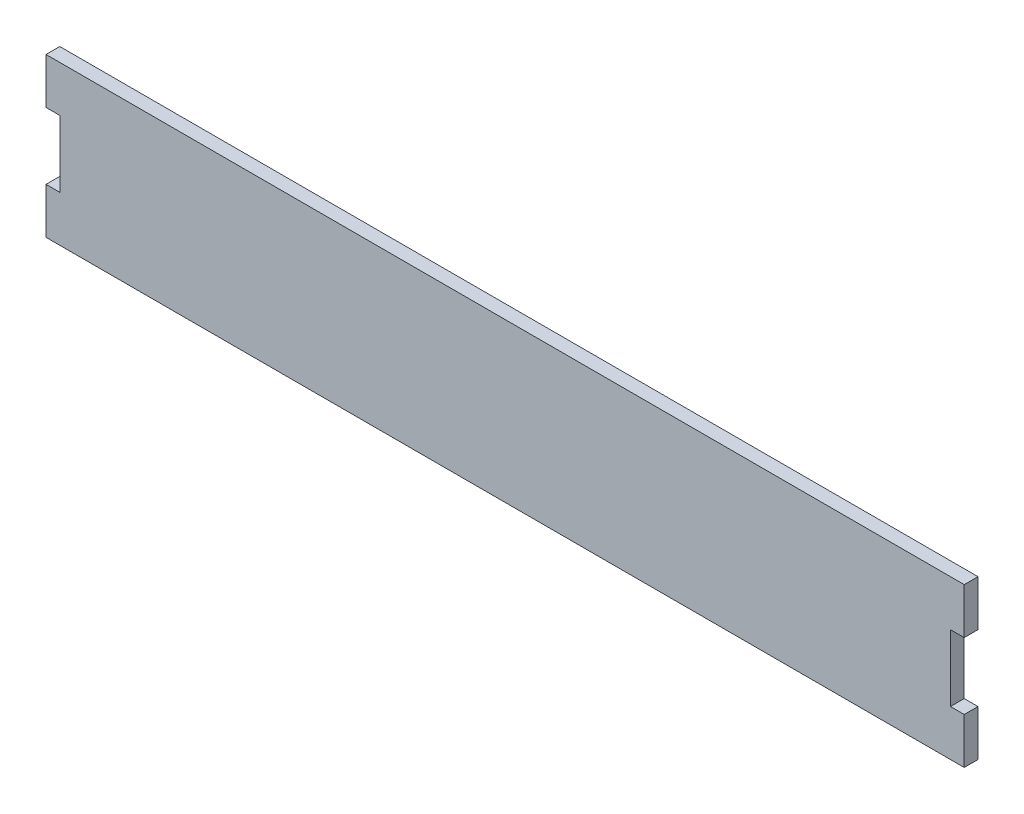
ISO-10303-21;
HEADER;
FILE_DESCRIPTION(('STEP AP214'),'2;1');
FILE_NAME('part.step','',(''),(''),'','','');
FILE_SCHEMA(('AUTOMOTIVE_DESIGN { 1 0 10303 214 1 1 1 1 }'));
ENDSEC;
DATA;
#1=APPLICATION_CONTEXT('core data for automotive mechanical design processes');
#2=APPLICATION_PROTOCOL_DEFINITION('international standard','automotive_design',2000,#1);
#3=PRODUCT_CONTEXT('',#1,'mechanical');
#4=PRODUCT('Part','Part','',(#3));
#5=PRODUCT_RELATED_PRODUCT_CATEGORY('part','',(#4));
#6=PRODUCT_DEFINITION_FORMATION('','',#4);
#7=PRODUCT_DEFINITION_CONTEXT('part definition',#1,'design');
#8=PRODUCT_DEFINITION('design','',#6,#7);
#9=PRODUCT_DEFINITION_SHAPE('','',#8);
#10=(LENGTH_UNIT() NAMED_UNIT(*) SI_UNIT(.MILLI.,.METRE.));
#11=(NAMED_UNIT(*) PLANE_ANGLE_UNIT() SI_UNIT($,.RADIAN.));
#12=(NAMED_UNIT(*) SI_UNIT($,.STERADIAN.) SOLID_ANGLE_UNIT());
#13=UNCERTAINTY_MEASURE_WITH_UNIT(LENGTH_MEASURE(1.E-05),#10,'distance_accuracy_value','');
#14=(GEOMETRIC_REPRESENTATION_CONTEXT(3) GLOBAL_UNCERTAINTY_ASSIGNED_CONTEXT((#13)) GLOBAL_UNIT_ASSIGNED_CONTEXT((#10,
#11,#12)) REPRESENTATION_CONTEXT('',''));
#15=CARTESIAN_POINT('',(0.,0.,0.));
#16=DIRECTION('',(0.,0.,1.));
#17=DIRECTION('',(1.,0.,0.));
#18=AXIS2_PLACEMENT_3D('',#15,#16,#17);
#19=CARTESIAN_POINT('',(0.,0.,3.));
#20=DIRECTION('',(0.,1.,0.));
#21=DIRECTION('',(0.,0.,1.));
#22=AXIS2_PLACEMENT_3D('',#19,#20,#21);
#23=PLANE('',#22);
#24=DIRECTION('',(1.,0.,0.));
#25=VECTOR('',#24,1.);
#26=CARTESIAN_POINT('',(0.,0.,0.));
#27=LINE('',#26,#25);
#28=CARTESIAN_POINT('',(0.,0.,0.));
#29=VERTEX_POINT('',#28);
#30=CARTESIAN_POINT('',(200.,0.,0.));
#31=VERTEX_POINT('',#30);
#32=EDGE_CURVE('E153',#29,#31,#27,.T.);
#33=ORIENTED_EDGE('',*,*,#32,.T.);
#34=DIRECTION('',(0.,0.,-1.));
#35=VECTOR('',#34,1.);
#36=CARTESIAN_POINT('',(200.,0.,3.));
#37=LINE('',#36,#35);
#38=CARTESIAN_POINT('',(200.,0.,3.));
#39=VERTEX_POINT('',#38);
#40=EDGE_CURVE('E11',#39,#31,#37,.T.);
#41=ORIENTED_EDGE('',*,*,#40,.F.);
#42=DIRECTION('',(1.,0.,0.));
#43=VECTOR('',#42,1.);
#44=CARTESIAN_POINT('',(0.,0.,3.));
#45=LINE('',#44,#43);
#46=CARTESIAN_POINT('',(0.,0.,3.));
#47=VERTEX_POINT('',#46);
#48=EDGE_CURVE('E175',#47,#39,#45,.T.);
#49=ORIENTED_EDGE('',*,*,#48,.F.);
#50=DIRECTION('',(0.,0.,-1.));
#51=VECTOR('',#50,1.);
#52=CARTESIAN_POINT('',(0.,0.,3.));
#53=LINE('',#52,#51);
#54=EDGE_CURVE('E149',#47,#29,#53,.T.);
#55=ORIENTED_EDGE('',*,*,#54,.T.);
#56=EDGE_LOOP('',(#33,#41,#49,#55));
#57=FACE_BOUND('',#56,.T.);
#58=ADVANCED_FACE('F33',(#57),#23,.F.);
#59=CARTESIAN_POINT('',(200.,10.,3.));
#60=DIRECTION('',(-1.,0.,0.));
#61=DIRECTION('',(0.,-1.,0.));
#62=AXIS2_PLACEMENT_3D('',#59,#60,#61);
#63=PLANE('',#62);
#64=DIRECTION('',(0.,1.,0.));
#65=VECTOR('',#64,1.);
#66=CARTESIAN_POINT('',(200.,10.,0.));
#67=LINE('',#66,#65);
#68=CARTESIAN_POINT('',(200.,10.,0.));
#69=VERTEX_POINT('',#68);
#70=EDGE_CURVE('E156',#31,#69,#67,.T.);
#71=ORIENTED_EDGE('',*,*,#70,.T.);
#72=DIRECTION('',(0.,0.,-1.));
#73=VECTOR('',#72,1.);
#74=CARTESIAN_POINT('',(200.,10.,3.));
#75=LINE('',#74,#73);
#76=CARTESIAN_POINT('',(200.,10.,3.));
#77=VERTEX_POINT('',#76);
#78=EDGE_CURVE('E41',#77,#69,#75,.T.);
#79=ORIENTED_EDGE('',*,*,#78,.F.);
#80=DIRECTION('',(0.,1.,0.));
#81=VECTOR('',#80,1.);
#82=CARTESIAN_POINT('',(200.,10.,3.));
#83=LINE('',#82,#81);
#84=EDGE_CURVE('E104',#39,#77,#83,.T.);
#85=ORIENTED_EDGE('',*,*,#84,.F.);
#86=ORIENTED_EDGE('',*,*,#40,.T.);
#87=EDGE_LOOP('',(#71,#79,#85,#86));
#88=FACE_BOUND('',#87,.T.);
#89=ADVANCED_FACE('F253',(#88),#63,.F.);
#90=CARTESIAN_POINT('',(197.,10.,3.));
#91=DIRECTION('',(0.,-1.,0.));
#92=DIRECTION('',(0.,0.,-1.));
#93=AXIS2_PLACEMENT_3D('',#90,#91,#92);
#94=PLANE('',#93);
#95=DIRECTION('',(-1.,0.,0.));
#96=VECTOR('',#95,1.);
#97=CARTESIAN_POINT('',(197.,10.,0.));
#98=LINE('',#97,#96);
#99=CARTESIAN_POINT('',(197.,10.,0.));
#100=VERTEX_POINT('',#99);
#101=EDGE_CURVE('E158',#69,#100,#98,.T.);
#102=ORIENTED_EDGE('',*,*,#101,.T.);
#103=DIRECTION('',(0.,0.,-1.));
#104=VECTOR('',#103,1.);
#105=CARTESIAN_POINT('',(197.,10.,3.));
#106=LINE('',#105,#104);
#107=CARTESIAN_POINT('',(197.,10.,3.));
#108=VERTEX_POINT('',#107);
#109=EDGE_CURVE('E194',#108,#100,#106,.T.);
#110=ORIENTED_EDGE('',*,*,#109,.F.);
#111=DIRECTION('',(-1.,0.,0.));
#112=VECTOR('',#111,1.);
#113=CARTESIAN_POINT('',(197.,10.,3.));
#114=LINE('',#113,#112);
#115=EDGE_CURVE('E202',#77,#108,#114,.T.);
#116=ORIENTED_EDGE('',*,*,#115,.F.);
#117=ORIENTED_EDGE('',*,*,#78,.T.);
#118=EDGE_LOOP('',(#102,#110,#116,#117));
#119=FACE_BOUND('',#118,.T.);
#120=ADVANCED_FACE('F200',(#119),#94,.F.);
#121=CARTESIAN_POINT('',(197.,24.5,3.));
#122=DIRECTION('',(-1.,0.,0.));
#123=DIRECTION('',(0.,0.,1.));
#124=AXIS2_PLACEMENT_3D('',#121,#122,#123);
#125=PLANE('',#124);
#126=DIRECTION('',(0.,1.,0.));
#127=VECTOR('',#126,1.);
#128=CARTESIAN_POINT('',(197.,24.5,0.));
#129=LINE('',#128,#127);
#130=CARTESIAN_POINT('',(197.,24.5,0.));
#131=VERTEX_POINT('',#130);
#132=EDGE_CURVE('E160',#100,#131,#129,.T.);
#133=ORIENTED_EDGE('',*,*,#132,.T.);
#134=DIRECTION('',(0.,0.,-1.));
#135=VECTOR('',#134,1.);
#136=CARTESIAN_POINT('',(197.,24.5,3.));
#137=LINE('',#136,#135);
#138=CARTESIAN_POINT('',(197.,24.5,3.));
#139=VERTEX_POINT('',#138);
#140=EDGE_CURVE('E191',#139,#131,#137,.T.);
#141=ORIENTED_EDGE('',*,*,#140,.F.);
#142=DIRECTION('',(0.,1.,0.));
#143=VECTOR('',#142,1.);
#144=CARTESIAN_POINT('',(197.,24.5,3.));
#145=LINE('',#144,#143);
#146=EDGE_CURVE('E220',#108,#139,#145,.T.);
#147=ORIENTED_EDGE('',*,*,#146,.F.);
#148=ORIENTED_EDGE('',*,*,#109,.T.);
#149=EDGE_LOOP('',(#133,#141,#147,#148));
#150=FACE_BOUND('',#149,.T.);
#151=ADVANCED_FACE('F211',(#150),#125,.F.);
#152=CARTESIAN_POINT('',(200.,24.5,3.));
#153=DIRECTION('',(0.,1.,0.));
#154=DIRECTION('',(0.,0.,1.));
#155=AXIS2_PLACEMENT_3D('',#152,#153,#154);
#156=PLANE('',#155);
#157=DIRECTION('',(1.,0.,0.));
#158=VECTOR('',#157,1.);
#159=CARTESIAN_POINT('',(200.,24.5,0.));
#160=LINE('',#159,#158);
#161=CARTESIAN_POINT('',(200.,24.5,0.));
#162=VERTEX_POINT('',#161);
#163=EDGE_CURVE('E162',#131,#162,#160,.T.);
#164=ORIENTED_EDGE('',*,*,#163,.T.);
#165=DIRECTION('',(0.,0.,-1.));
#166=VECTOR('',#165,1.);
#167=CARTESIAN_POINT('',(200.,24.5,3.));
#168=LINE('',#167,#166);
#169=CARTESIAN_POINT('',(200.,24.5,3.));
#170=VERTEX_POINT('',#169);
#171=EDGE_CURVE('E188',#170,#162,#168,.T.);
#172=ORIENTED_EDGE('',*,*,#171,.F.);
#173=DIRECTION('',(1.,0.,0.));
#174=VECTOR('',#173,1.);
#175=CARTESIAN_POINT('',(200.,24.5,3.));
#176=LINE('',#175,#174);
#177=EDGE_CURVE('E217',#139,#170,#176,.T.);
#178=ORIENTED_EDGE('',*,*,#177,.F.);
#179=ORIENTED_EDGE('',*,*,#140,.T.);
#180=EDGE_LOOP('',(#164,#172,#178,#179));
#181=FACE_BOUND('',#180,.T.);
#182=ADVANCED_FACE('F215',(#181),#156,.F.);
#183=CARTESIAN_POINT('',(200.,34.5,3.));
#184=DIRECTION('',(-1.,0.,0.));
#185=DIRECTION('',(0.,-1.,0.));
#186=AXIS2_PLACEMENT_3D('',#183,#184,#185);
#187=PLANE('',#186);
#188=DIRECTION('',(0.,1.,0.));
#189=VECTOR('',#188,1.);
#190=CARTESIAN_POINT('',(200.,34.5,0.));
#191=LINE('',#190,#189);
#192=CARTESIAN_POINT('',(200.,34.5,0.));
#193=VERTEX_POINT('',#192);
#194=EDGE_CURVE('E164',#162,#193,#191,.T.);
#195=ORIENTED_EDGE('',*,*,#194,.T.);
#196=DIRECTION('',(0.,0.,-1.));
#197=VECTOR('',#196,1.);
#198=CARTESIAN_POINT('',(200.,34.5,3.));
#199=LINE('',#198,#197);
#200=CARTESIAN_POINT('',(200.,34.5,3.));
#201=VERTEX_POINT('',#200);
#202=EDGE_CURVE('E185',#201,#193,#199,.T.);
#203=ORIENTED_EDGE('',*,*,#202,.F.);
#204=DIRECTION('',(0.,1.,0.));
#205=VECTOR('',#204,1.);
#206=CARTESIAN_POINT('',(200.,34.5,3.));
#207=LINE('',#206,#205);
#208=EDGE_CURVE('E219',#170,#201,#207,.T.);
#209=ORIENTED_EDGE('',*,*,#208,.F.);
#210=ORIENTED_EDGE('',*,*,#171,.T.);
#211=EDGE_LOOP('',(#195,#203,#209,#210));
#212=FACE_BOUND('',#211,.T.);
#213=ADVANCED_FACE('F266',(#212),#187,.F.);
#214=CARTESIAN_POINT('',(0.,34.5,3.));
#215=DIRECTION('',(0.,-1.,0.));
#216=DIRECTION('',(0.,0.,-1.));
#217=AXIS2_PLACEMENT_3D('',#214,#215,#216);
#218=PLANE('',#217);
#219=DIRECTION('',(-1.,0.,0.));
#220=VECTOR('',#219,1.);
#221=CARTESIAN_POINT('',(0.,34.5,0.));
#222=LINE('',#221,#220);
#223=CARTESIAN_POINT('',(0.,34.5,0.));
#224=VERTEX_POINT('',#223);
#225=EDGE_CURVE('E166',#193,#224,#222,.T.);
#226=ORIENTED_EDGE('',*,*,#225,.T.);
#227=DIRECTION('',(0.,0.,-1.));
#228=VECTOR('',#227,1.);
#229=CARTESIAN_POINT('',(0.,34.5,3.));
#230=LINE('',#229,#228);
#231=CARTESIAN_POINT('',(0.,34.5,3.));
#232=VERTEX_POINT('',#231);
#233=EDGE_CURVE('E182',#232,#224,#230,.T.);
#234=ORIENTED_EDGE('',*,*,#233,.F.);
#235=DIRECTION('',(-1.,0.,0.));
#236=VECTOR('',#235,1.);
#237=CARTESIAN_POINT('',(0.,34.5,3.));
#238=LINE('',#237,#236);
#239=EDGE_CURVE('E222',#201,#232,#238,.T.);
#240=ORIENTED_EDGE('',*,*,#239,.F.);
#241=ORIENTED_EDGE('',*,*,#202,.T.);
#242=EDGE_LOOP('',(#226,#234,#240,#241));
#243=FACE_BOUND('',#242,.T.);
#244=ADVANCED_FACE('F269',(#243),#218,.F.);
#245=CARTESIAN_POINT('',(0.,34.5,3.));
#246=DIRECTION('',(1.,0.,0.));
#247=DIRECTION('',(0.,0.,-1.));
#248=AXIS2_PLACEMENT_3D('',#245,#246,#247);
#249=PLANE('',#248);
#250=DIRECTION('',(0.,-1.,0.));
#251=VECTOR('',#250,1.);
#252=CARTESIAN_POINT('',(0.,34.5,0.));
#253=LINE('',#252,#251);
#254=CARTESIAN_POINT('',(0.,24.5,0.));
#255=VERTEX_POINT('',#254);
#256=EDGE_CURVE('E168',#224,#255,#253,.T.);
#257=ORIENTED_EDGE('',*,*,#256,.T.);
#258=DIRECTION('',(0.,0.,-1.));
#259=VECTOR('',#258,1.);
#260=CARTESIAN_POINT('',(0.,24.5,3.));
#261=LINE('',#260,#259);
#262=CARTESIAN_POINT('',(0.,24.5,3.));
#263=VERTEX_POINT('',#262);
#264=EDGE_CURVE('E179',#263,#255,#261,.T.);
#265=ORIENTED_EDGE('',*,*,#264,.F.);
#266=DIRECTION('',(0.,-1.,0.));
#267=VECTOR('',#266,1.);
#268=CARTESIAN_POINT('',(0.,34.5,3.));
#269=LINE('',#268,#267);
#270=EDGE_CURVE('E228',#232,#263,#269,.T.);
#271=ORIENTED_EDGE('',*,*,#270,.F.);
#272=ORIENTED_EDGE('',*,*,#233,.T.);
#273=EDGE_LOOP('',(#257,#265,#271,#272));
#274=FACE_BOUND('',#273,.T.);
#275=ADVANCED_FACE('F234',(#274),#249,.F.);
#276=CARTESIAN_POINT('',(0.,24.5,3.));
#277=DIRECTION('',(0.,1.,0.));
#278=DIRECTION('',(0.,0.,1.));
#279=AXIS2_PLACEMENT_3D('',#276,#277,#278);
#280=PLANE('',#279);
#281=DIRECTION('',(1.,0.,0.));
#282=VECTOR('',#281,1.);
#283=CARTESIAN_POINT('',(0.,24.5,0.));
#284=LINE('',#283,#282);
#285=CARTESIAN_POINT('',(3.,24.5,0.));
#286=VERTEX_POINT('',#285);
#287=EDGE_CURVE('E170',#255,#286,#284,.T.);
#288=ORIENTED_EDGE('',*,*,#287,.T.);
#289=DIRECTION('',(0.,0.,-1.));
#290=VECTOR('',#289,1.);
#291=CARTESIAN_POINT('',(3.,24.5,3.));
#292=LINE('',#291,#290);
#293=CARTESIAN_POINT('',(3.,24.5,3.));
#294=VERTEX_POINT('',#293);
#295=EDGE_CURVE('E144',#294,#286,#292,.T.);
#296=ORIENTED_EDGE('',*,*,#295,.F.);
#297=DIRECTION('',(1.,0.,0.));
#298=VECTOR('',#297,1.);
#299=CARTESIAN_POINT('',(0.,24.5,3.));
#300=LINE('',#299,#298);
#301=EDGE_CURVE('E135',#263,#294,#300,.T.);
#302=ORIENTED_EDGE('',*,*,#301,.F.);
#303=ORIENTED_EDGE('',*,*,#264,.T.);
#304=EDGE_LOOP('',(#288,#296,#302,#303));
#305=FACE_BOUND('',#304,.T.);
#306=ADVANCED_FACE('F238',(#305),#280,.F.);
#307=CARTESIAN_POINT('',(3.,24.5,3.));
#308=DIRECTION('',(1.,0.,0.));
#309=DIRECTION('',(0.,0.,-1.));
#310=AXIS2_PLACEMENT_3D('',#307,#308,#309);
#311=PLANE('',#310);
#312=DIRECTION('',(0.,-1.,0.));
#313=VECTOR('',#312,1.);
#314=CARTESIAN_POINT('',(3.,24.5,0.));
#315=LINE('',#314,#313);
#316=CARTESIAN_POINT('',(3.,10.,0.));
#317=VERTEX_POINT('',#316);
#318=EDGE_CURVE('E143',#286,#317,#315,.T.);
#319=ORIENTED_EDGE('',*,*,#318,.T.);
#320=DIRECTION('',(0.,0.,-1.));
#321=VECTOR('',#320,1.);
#322=CARTESIAN_POINT('',(3.,10.,3.));
#323=LINE('',#322,#321);
#324=CARTESIAN_POINT('',(3.,10.,3.));
#325=VERTEX_POINT('',#324);
#326=EDGE_CURVE('E140',#325,#317,#323,.T.);
#327=ORIENTED_EDGE('',*,*,#326,.F.);
#328=DIRECTION('',(0.,-1.,0.));
#329=VECTOR('',#328,1.);
#330=CARTESIAN_POINT('',(3.,24.5,3.));
#331=LINE('',#330,#329);
#332=EDGE_CURVE('E129',#294,#325,#331,.T.);
#333=ORIENTED_EDGE('',*,*,#332,.F.);
#334=ORIENTED_EDGE('',*,*,#295,.T.);
#335=EDGE_LOOP('',(#319,#327,#333,#334));
#336=FACE_BOUND('',#335,.T.);
#337=ADVANCED_FACE('F141',(#336),#311,.F.);
#338=CARTESIAN_POINT('',(0.,10.,3.));
#339=DIRECTION('',(0.,-1.,0.));
#340=DIRECTION('',(0.,0.,-1.));
#341=AXIS2_PLACEMENT_3D('',#338,#339,#340);
#342=PLANE('',#341);
#343=DIRECTION('',(-1.,0.,0.));
#344=VECTOR('',#343,1.);
#345=CARTESIAN_POINT('',(0.,10.,0.));
#346=LINE('',#345,#344);
#347=CARTESIAN_POINT('',(0.,10.,0.));
#348=VERTEX_POINT('',#347);
#349=EDGE_CURVE('E90',#317,#348,#346,.T.);
#350=ORIENTED_EDGE('',*,*,#349,.T.);
#351=DIRECTION('',(0.,0.,-1.));
#352=VECTOR('',#351,1.);
#353=CARTESIAN_POINT('',(0.,10.,3.));
#354=LINE('',#353,#352);
#355=CARTESIAN_POINT('',(0.,10.,3.));
#356=VERTEX_POINT('',#355);
#357=EDGE_CURVE('E145',#356,#348,#354,.T.);
#358=ORIENTED_EDGE('',*,*,#357,.F.);
#359=DIRECTION('',(-1.,0.,0.));
#360=VECTOR('',#359,1.);
#361=CARTESIAN_POINT('',(0.,10.,3.));
#362=LINE('',#361,#360);
#363=EDGE_CURVE('E133',#325,#356,#362,.T.);
#364=ORIENTED_EDGE('',*,*,#363,.F.);
#365=ORIENTED_EDGE('',*,*,#326,.T.);
#366=EDGE_LOOP('',(#350,#358,#364,#365));
#367=FACE_BOUND('',#366,.T.);
#368=ADVANCED_FACE('F147',(#367),#342,.F.);
#369=CARTESIAN_POINT('',(0.,0.,3.));
#370=DIRECTION('',(1.,0.,0.));
#371=DIRECTION('',(0.,0.,-1.));
#372=AXIS2_PLACEMENT_3D('',#369,#370,#371);
#373=PLANE('',#372);
#374=DIRECTION('',(0.,-1.,0.));
#375=VECTOR('',#374,1.);
#376=CARTESIAN_POINT('',(0.,0.,0.));
#377=LINE('',#376,#375);
#378=EDGE_CURVE('E96',#348,#29,#377,.T.);
#379=ORIENTED_EDGE('',*,*,#378,.T.);
#380=ORIENTED_EDGE('',*,*,#54,.F.);
#381=DIRECTION('',(0.,-1.,0.));
#382=VECTOR('',#381,1.);
#383=CARTESIAN_POINT('',(0.,0.,3.));
#384=LINE('',#383,#382);
#385=EDGE_CURVE('E49',#356,#47,#384,.T.);
#386=ORIENTED_EDGE('',*,*,#385,.F.);
#387=ORIENTED_EDGE('',*,*,#357,.T.);
#388=EDGE_LOOP('',(#379,#380,#386,#387));
#389=FACE_BOUND('',#388,.T.);
#390=ADVANCED_FACE('F242',(#389),#373,.F.);
#391=CARTESIAN_POINT('',(0.,0.,3.));
#392=DIRECTION('',(0.,0.,-1.));
#393=DIRECTION('',(-1.,0.,0.));
#394=AXIS2_PLACEMENT_3D('',#391,#392,#393);
#395=PLANE('',#394);
#396=ORIENTED_EDGE('',*,*,#48,.T.);
#397=ORIENTED_EDGE('',*,*,#84,.T.);
#398=ORIENTED_EDGE('',*,*,#115,.T.);
#399=ORIENTED_EDGE('',*,*,#146,.T.);
#400=ORIENTED_EDGE('',*,*,#177,.T.);
#401=ORIENTED_EDGE('',*,*,#208,.T.);
#402=ORIENTED_EDGE('',*,*,#239,.T.);
#403=ORIENTED_EDGE('',*,*,#270,.T.);
#404=ORIENTED_EDGE('',*,*,#301,.T.);
#405=ORIENTED_EDGE('',*,*,#332,.T.);
#406=ORIENTED_EDGE('',*,*,#363,.T.);
#407=ORIENTED_EDGE('',*,*,#385,.T.);
#408=EDGE_LOOP('',(#396,#397,#398,#399,#400,#401,#402,#403,#404,#405,#406,#407));
#409=FACE_BOUND('',#408,.T.);
#410=ADVANCED_FACE('F131',(#409),#395,.F.);
#411=CARTESIAN_POINT('',(0.,0.,0.));
#412=DIRECTION('',(0.,0.,-1.));
#413=DIRECTION('',(-1.,0.,0.));
#414=AXIS2_PLACEMENT_3D('',#411,#412,#413);
#415=PLANE('',#414);
#416=ORIENTED_EDGE('',*,*,#32,.F.);
#417=ORIENTED_EDGE('',*,*,#378,.F.);
#418=ORIENTED_EDGE('',*,*,#349,.F.);
#419=ORIENTED_EDGE('',*,*,#318,.F.);
#420=ORIENTED_EDGE('',*,*,#287,.F.);
#421=ORIENTED_EDGE('',*,*,#256,.F.);
#422=ORIENTED_EDGE('',*,*,#225,.F.);
#423=ORIENTED_EDGE('',*,*,#194,.F.);
#424=ORIENTED_EDGE('',*,*,#163,.F.);
#425=ORIENTED_EDGE('',*,*,#132,.F.);
#426=ORIENTED_EDGE('',*,*,#101,.F.);
#427=ORIENTED_EDGE('',*,*,#70,.F.);
#428=EDGE_LOOP('',(#416,#417,#418,#419,#420,#421,#422,#423,#424,#425,#426,#427));
#429=FACE_BOUND('',#428,.T.);
#430=ADVANCED_FACE('F206',(#429),#415,.T.);
#431=CLOSED_SHELL('',(#58,#89,#120,#151,#182,#213,#244,#275,#306,#337,#368,#390,#410,#430));
#432=MANIFOLD_SOLID_BREP('B2',#431);
#433=ADVANCED_BREP_SHAPE_REPRESENTATION('',(#18,#432),#14);
#434=SHAPE_DEFINITION_REPRESENTATION(#9,#433);
ENDSEC;
END-ISO-10303-21;
